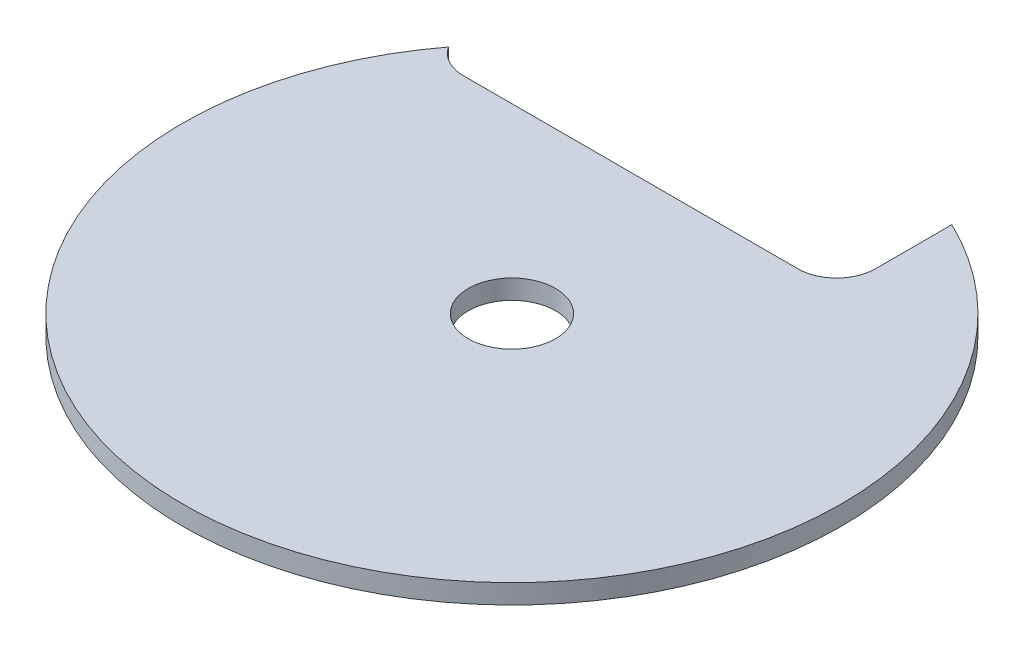
ISO-10303-21;
HEADER;
FILE_DESCRIPTION(('STEP AP214'),'2;1');
FILE_NAME('part.step','',(''),(''),'','','');
FILE_SCHEMA(('AUTOMOTIVE_DESIGN { 1 0 10303 214 1 1 1 1 }'));
ENDSEC;
DATA;
#1=APPLICATION_CONTEXT('core data for automotive mechanical design processes');
#2=APPLICATION_PROTOCOL_DEFINITION('international standard','automotive_design',2000,#1);
#3=PRODUCT_CONTEXT('',#1,'mechanical');
#4=PRODUCT('Part','Part','',(#3));
#5=PRODUCT_RELATED_PRODUCT_CATEGORY('part','',(#4));
#6=PRODUCT_DEFINITION_FORMATION('','',#4);
#7=PRODUCT_DEFINITION_CONTEXT('part definition',#1,'design');
#8=PRODUCT_DEFINITION('design','',#6,#7);
#9=PRODUCT_DEFINITION_SHAPE('','',#8);
#10=(LENGTH_UNIT() NAMED_UNIT(*) SI_UNIT(.MILLI.,.METRE.));
#11=(NAMED_UNIT(*) PLANE_ANGLE_UNIT() SI_UNIT($,.RADIAN.));
#12=(NAMED_UNIT(*) SI_UNIT($,.STERADIAN.) SOLID_ANGLE_UNIT());
#13=UNCERTAINTY_MEASURE_WITH_UNIT(LENGTH_MEASURE(1.E-05),#10,'distance_accuracy_value','');
#14=(GEOMETRIC_REPRESENTATION_CONTEXT(3) GLOBAL_UNCERTAINTY_ASSIGNED_CONTEXT((#13)) GLOBAL_UNIT_ASSIGNED_CONTEXT((#10,
#11,#12)) REPRESENTATION_CONTEXT('',''));
#15=CARTESIAN_POINT('',(0.,0.,0.));
#16=DIRECTION('',(0.,0.,1.));
#17=DIRECTION('',(1.,0.,0.));
#18=AXIS2_PLACEMENT_3D('',#15,#16,#17);
#19=CARTESIAN_POINT('',(22.3156550714144,42.9484850412162,624.040270184876));
#20=DIRECTION('',(0.,-1.,0.));
#21=DIRECTION('',(0.,0.,1.));
#22=AXIS2_PLACEMENT_3D('',#19,#20,#21);
#23=CYLINDRICAL_SURFACE('',#22,34.);
#24=DIRECTION('',(0.,-1.,0.));
#25=VECTOR('',#24,1.);
#26=CARTESIAN_POINT('',(37.0656312445709,42.9484850412162,593.406331442179));
#27=LINE('',#26,#25);
#28=CARTESIAN_POINT('',(37.0656312445709,42.9484850412162,593.406331442179));
#29=VERTEX_POINT('',#28);
#30=CARTESIAN_POINT('',(37.0656312445709,40.9484850412162,593.406331442179));
#31=VERTEX_POINT('',#30);
#32=EDGE_CURVE('E104',#29,#31,#27,.T.);
#33=ORIENTED_EDGE('',*,*,#32,.F.);
#34=CARTESIAN_POINT('',(22.3156550714144,42.9484850412162,624.040270184876));
#35=DIRECTION('',(0.,-1.,0.));
#36=DIRECTION('',(0.,0.,-1.));
#37=AXIS2_PLACEMENT_3D('',#34,#35,#36);
#38=CIRCLE('',#37,34.);
#39=CARTESIAN_POINT('',(-4.773230040349,42.9484850412162,603.492951542248));
#40=VERTEX_POINT('',#39);
#41=EDGE_CURVE('E102',#29,#40,#38,.T.);
#42=ORIENTED_EDGE('',*,*,#41,.T.);
#43=DIRECTION('',(0.,-1.,0.));
#44=VECTOR('',#43,1.);
#45=CARTESIAN_POINT('',(-4.77323004034899,46.0534867100374,603.492951542248));
#46=LINE('',#45,#44);
#47=CARTESIAN_POINT('',(-4.773230040349,40.9484850412162,603.492951542248));
#48=VERTEX_POINT('',#47);
#49=EDGE_CURVE('E87',#48,#40,#46,.F.);
#50=ORIENTED_EDGE('',*,*,#49,.F.);
#51=CARTESIAN_POINT('',(22.3156550714144,40.9484850412162,624.040270184876));
#52=DIRECTION('',(0.,-1.,0.));
#53=DIRECTION('',(0.,0.,-1.));
#54=AXIS2_PLACEMENT_3D('',#51,#52,#53);
#55=CIRCLE('',#54,34.);
#56=EDGE_CURVE('E99',#31,#48,#55,.T.);
#57=ORIENTED_EDGE('',*,*,#56,.F.);
#58=EDGE_LOOP('',(#33,#42,#50,#57));
#59=FACE_BOUND('',#58,.T.);
#60=ADVANCED_FACE('F34',(#59),#23,.T.);
#61=CARTESIAN_POINT('',(22.3156550714144,42.9484850412162,624.040270184876));
#62=DIRECTION('',(0.,1.,0.));
#63=DIRECTION('',(0.,0.,-1.));
#64=AXIS2_PLACEMENT_3D('',#61,#62,#63);
#65=PLANE('',#64);
#66=CARTESIAN_POINT('',(22.3156312445709,42.9484850412162,624.040224750278));
#67=DIRECTION('',(0.,1.,0.));
#68=DIRECTION('',(0.,0.,1.));
#69=AXIS2_PLACEMENT_3D('',#66,#67,#68);
#70=CIRCLE('',#69,4.5);
#71=CARTESIAN_POINT('',(22.3156312445709,42.9484850412162,628.540224750278));
#72=VERTEX_POINT('',#71);
#73=EDGE_CURVE('E130',#72,#72,#70,.T.);
#74=ORIENTED_EDGE('',*,*,#73,.F.);
#75=EDGE_LOOP('',(#74));
#76=FACE_BOUND('',#75,.T.);
#77=ORIENTED_EDGE('',*,*,#41,.F.);
#78=DIRECTION('',(0.,0.,1.));
#79=VECTOR('',#78,1.);
#80=CARTESIAN_POINT('',(37.0656312445709,42.9484850412162,624.040270184876));
#81=LINE('',#80,#79);
#82=CARTESIAN_POINT('',(37.0656312445709,42.9484850412162,601.290224750278));
#83=VERTEX_POINT('',#82);
#84=EDGE_CURVE('E57',#29,#83,#81,.T.);
#85=ORIENTED_EDGE('',*,*,#84,.T.);
#86=CARTESIAN_POINT('',(33.0656312445709,42.9484850412162,601.290224750278));
#87=DIRECTION('',(0.,1.,0.));
#88=DIRECTION('',(0.,0.,1.));
#89=AXIS2_PLACEMENT_3D('',#86,#87,#88);
#90=CIRCLE('',#89,4.);
#91=CARTESIAN_POINT('',(33.0656312445709,42.9484850412162,605.290224750278));
#92=VERTEX_POINT('',#91);
#93=EDGE_CURVE('E93',#83,#92,#90,.F.);
#94=ORIENTED_EDGE('',*,*,#93,.T.);
#95=DIRECTION('',(-1.,0.,0.));
#96=VECTOR('',#95,1.);
#97=CARTESIAN_POINT('',(22.3156550714144,42.9484850412162,605.290224750278));
#98=LINE('',#97,#96);
#99=CARTESIAN_POINT('',(-1.43436875542907,42.9484850412162,605.290224750278));
#100=VERTEX_POINT('',#99);
#101=EDGE_CURVE('E80',#92,#100,#98,.T.);
#102=ORIENTED_EDGE('',*,*,#101,.T.);
#103=CARTESIAN_POINT('',(-1.43436875542905,42.9484850412162,601.290224750278));
#104=DIRECTION('',(0.,1.,0.));
#105=DIRECTION('',(0.,0.,1.));
#106=AXIS2_PLACEMENT_3D('',#103,#104,#105);
#107=CIRCLE('',#106,4.);
#108=EDGE_CURVE('E121',#100,#40,#107,.F.);
#109=ORIENTED_EDGE('',*,*,#108,.T.);
#110=EDGE_LOOP('',(#77,#85,#94,#102,#109));
#111=FACE_BOUND('',#110,.T.);
#112=ADVANCED_FACE('F98',(#76,#111),#65,.T.);
#113=CARTESIAN_POINT('',(22.3156550714144,40.9484850412162,624.040270184876));
#114=DIRECTION('',(0.,1.,0.));
#115=DIRECTION('',(0.,0.,-1.));
#116=AXIS2_PLACEMENT_3D('',#113,#114,#115);
#117=PLANE('',#116);
#118=CARTESIAN_POINT('',(22.3156312445709,40.9484850412162,624.040224750278));
#119=DIRECTION('',(0.,1.,0.));
#120=DIRECTION('',(0.,0.,1.));
#121=AXIS2_PLACEMENT_3D('',#118,#119,#120);
#122=CIRCLE('',#121,4.5);
#123=CARTESIAN_POINT('',(22.3156312445709,40.9484850412162,628.540224750278));
#124=VERTEX_POINT('',#123);
#125=EDGE_CURVE('E37',#124,#124,#122,.T.);
#126=ORIENTED_EDGE('',*,*,#125,.T.);
#127=EDGE_LOOP('',(#126));
#128=FACE_BOUND('',#127,.T.);
#129=DIRECTION('',(0.,0.,1.));
#130=VECTOR('',#129,1.);
#131=CARTESIAN_POINT('',(37.0656312445709,40.9484850412162,624.040270184876));
#132=LINE('',#131,#130);
#133=CARTESIAN_POINT('',(37.0656312445709,40.9484850412162,601.290224750278));
#134=VERTEX_POINT('',#133);
#135=EDGE_CURVE('E11',#31,#134,#132,.T.);
#136=ORIENTED_EDGE('',*,*,#135,.F.);
#137=ORIENTED_EDGE('',*,*,#56,.T.);
#138=CARTESIAN_POINT('',(-1.43436875542905,40.9484850412162,601.290224750278));
#139=DIRECTION('',(0.,1.,0.));
#140=DIRECTION('',(0.,0.,1.));
#141=AXIS2_PLACEMENT_3D('',#138,#139,#140);
#142=CIRCLE('',#141,4.);
#143=CARTESIAN_POINT('',(-1.43436875542907,40.9484850412162,605.290224750278));
#144=VERTEX_POINT('',#143);
#145=EDGE_CURVE('E112',#144,#48,#142,.F.);
#146=ORIENTED_EDGE('',*,*,#145,.F.);
#147=DIRECTION('',(-1.,0.,0.));
#148=VECTOR('',#147,1.);
#149=CARTESIAN_POINT('',(22.3156550714144,40.9484850412162,605.290224750278));
#150=LINE('',#149,#148);
#151=CARTESIAN_POINT('',(33.0656312445709,40.9484850412162,605.290224750278));
#152=VERTEX_POINT('',#151);
#153=EDGE_CURVE('E109',#152,#144,#150,.T.);
#154=ORIENTED_EDGE('',*,*,#153,.F.);
#155=CARTESIAN_POINT('',(33.0656312445709,40.9484850412162,601.290224750278));
#156=DIRECTION('',(0.,1.,0.));
#157=DIRECTION('',(0.,0.,1.));
#158=AXIS2_PLACEMENT_3D('',#155,#156,#157);
#159=CIRCLE('',#158,4.);
#160=EDGE_CURVE('E42',#134,#152,#159,.F.);
#161=ORIENTED_EDGE('',*,*,#160,.F.);
#162=EDGE_LOOP('',(#136,#137,#146,#154,#161));
#163=FACE_BOUND('',#162,.T.);
#164=ADVANCED_FACE('F124',(#128,#163),#117,.F.);
#165=CARTESIAN_POINT('',(33.0656312445709,56.9895146398773,601.290224750278));
#166=DIRECTION('',(0.,-1.,0.));
#167=DIRECTION('',(1.,0.,0.));
#168=AXIS2_PLACEMENT_3D('',#165,#166,#167);
#169=CYLINDRICAL_SURFACE('',#168,4.);
#170=DIRECTION('',(0.,-1.,0.));
#171=VECTOR('',#170,1.);
#172=CARTESIAN_POINT('',(37.0656312445709,56.9895146398773,601.290224750278));
#173=LINE('',#172,#171);
#174=EDGE_CURVE('E88',#83,#134,#173,.T.);
#175=ORIENTED_EDGE('',*,*,#174,.T.);
#176=ORIENTED_EDGE('',*,*,#160,.T.);
#177=DIRECTION('',(0.,-1.,0.));
#178=VECTOR('',#177,1.);
#179=CARTESIAN_POINT('',(33.0656312445709,56.9895146398773,605.290224750278));
#180=LINE('',#179,#178);
#181=EDGE_CURVE('E49',#92,#152,#180,.T.);
#182=ORIENTED_EDGE('',*,*,#181,.F.);
#183=ORIENTED_EDGE('',*,*,#93,.F.);
#184=EDGE_LOOP('',(#175,#176,#182,#183));
#185=FACE_BOUND('',#184,.T.);
#186=ADVANCED_FACE('F92',(#185),#169,.F.);
#187=CARTESIAN_POINT('',(-1.43436875542909,56.9895146398772,605.290224750278));
#188=DIRECTION('',(0.,0.,-1.));
#189=DIRECTION('',(0.,1.,0.));
#190=AXIS2_PLACEMENT_3D('',#187,#188,#189);
#191=PLANE('',#190);
#192=ORIENTED_EDGE('',*,*,#181,.T.);
#193=ORIENTED_EDGE('',*,*,#153,.T.);
#194=DIRECTION('',(0.,-1.,0.));
#195=VECTOR('',#194,1.);
#196=CARTESIAN_POINT('',(-1.43436875542909,56.9895146398772,605.290224750278));
#197=LINE('',#196,#195);
#198=EDGE_CURVE('E83',#100,#144,#197,.T.);
#199=ORIENTED_EDGE('',*,*,#198,.F.);
#200=ORIENTED_EDGE('',*,*,#101,.F.);
#201=EDGE_LOOP('',(#192,#193,#199,#200));
#202=FACE_BOUND('',#201,.T.);
#203=ADVANCED_FACE('F81',(#202),#191,.T.);
#204=CARTESIAN_POINT('',(37.0656312445709,56.9895146398773,601.290224750278));
#205=DIRECTION('',(-1.,0.,0.));
#206=DIRECTION('',(0.,-1.,0.));
#207=AXIS2_PLACEMENT_3D('',#204,#205,#206);
#208=PLANE('',#207);
#209=ORIENTED_EDGE('',*,*,#32,.T.);
#210=ORIENTED_EDGE('',*,*,#135,.T.);
#211=ORIENTED_EDGE('',*,*,#174,.F.);
#212=ORIENTED_EDGE('',*,*,#84,.F.);
#213=EDGE_LOOP('',(#209,#210,#211,#212));
#214=FACE_BOUND('',#213,.T.);
#215=ADVANCED_FACE('F125',(#214),#208,.T.);
#216=CARTESIAN_POINT('',(-1.43436875542907,56.9895146398772,601.290224750278));
#217=DIRECTION('',(0.,-1.,0.));
#218=DIRECTION('',(1.,0.,0.));
#219=AXIS2_PLACEMENT_3D('',#216,#217,#218);
#220=CYLINDRICAL_SURFACE('',#219,4.);
#221=ORIENTED_EDGE('',*,*,#198,.T.);
#222=ORIENTED_EDGE('',*,*,#145,.T.);
#223=ORIENTED_EDGE('',*,*,#49,.T.);
#224=ORIENTED_EDGE('',*,*,#108,.F.);
#225=EDGE_LOOP('',(#221,#222,#223,#224));
#226=FACE_BOUND('',#225,.T.);
#227=ADVANCED_FACE('F117',(#226),#220,.F.);
#228=CARTESIAN_POINT('',(22.3156312445709,30.9484850412162,624.040224750278));
#229=DIRECTION('',(0.,1.,0.));
#230=DIRECTION('',(0.,0.,1.));
#231=AXIS2_PLACEMENT_3D('',#228,#229,#230);
#232=CYLINDRICAL_SURFACE('',#231,4.5);
#233=ORIENTED_EDGE('',*,*,#73,.T.);
#234=EDGE_LOOP('',(#233));
#235=FACE_BOUND('',#234,.T.);
#236=ORIENTED_EDGE('',*,*,#125,.F.);
#237=EDGE_LOOP('',(#236));
#238=FACE_BOUND('',#237,.T.);
#239=ADVANCED_FACE('F138',(#235,#238),#232,.F.);
#240=CLOSED_SHELL('',(#60,#112,#164,#186,#203,#215,#227,#239));
#241=MANIFOLD_SOLID_BREP('B2',#240);
#242=ADVANCED_BREP_SHAPE_REPRESENTATION('',(#18,#241),#14);
#243=SHAPE_DEFINITION_REPRESENTATION(#9,#242);
ENDSEC;
END-ISO-10303-21;
